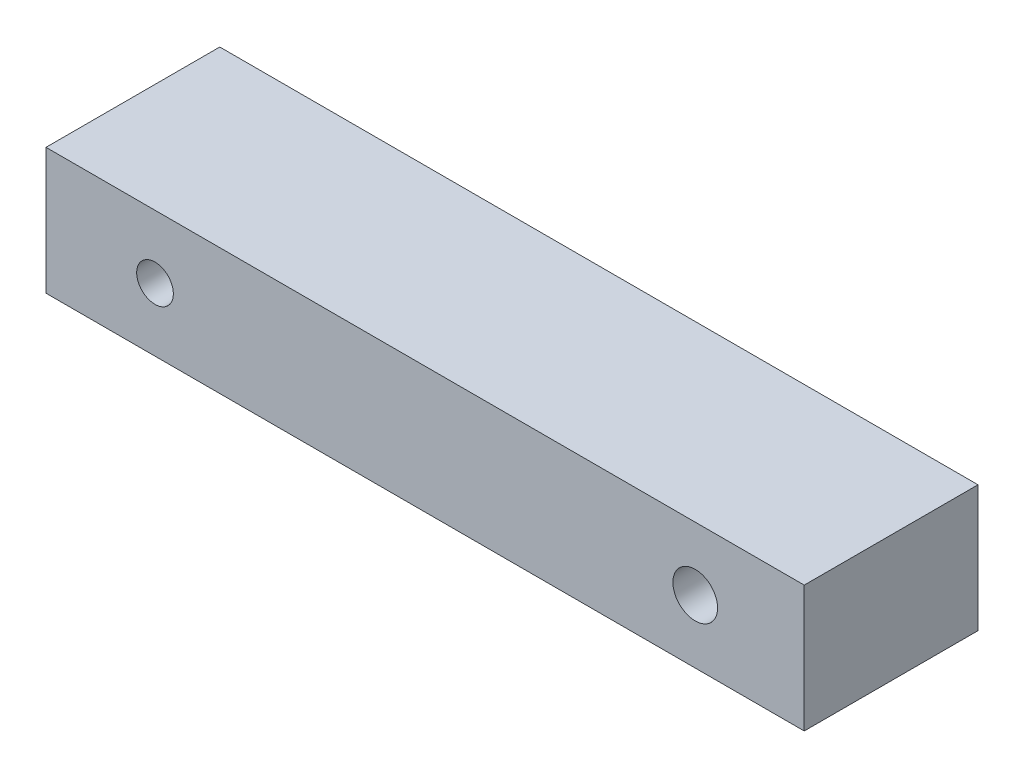
ISO-10303-21;
HEADER;
FILE_DESCRIPTION(('STEP AP214'),'2;1');
FILE_NAME('part.step','',(''),(''),'','','');
FILE_SCHEMA(('AUTOMOTIVE_DESIGN { 1 0 10303 214 1 1 1 1 }'));
ENDSEC;
DATA;
#1=APPLICATION_CONTEXT('core data for automotive mechanical design processes');
#2=APPLICATION_PROTOCOL_DEFINITION('international standard','automotive_design',2000,#1);
#3=PRODUCT_CONTEXT('',#1,'mechanical');
#4=PRODUCT('Part','Part','',(#3));
#5=PRODUCT_RELATED_PRODUCT_CATEGORY('part','',(#4));
#6=PRODUCT_DEFINITION_FORMATION('','',#4);
#7=PRODUCT_DEFINITION_CONTEXT('part definition',#1,'design');
#8=PRODUCT_DEFINITION('design','',#6,#7);
#9=PRODUCT_DEFINITION_SHAPE('','',#8);
#10=(LENGTH_UNIT() NAMED_UNIT(*) SI_UNIT(.MILLI.,.METRE.));
#11=(NAMED_UNIT(*) PLANE_ANGLE_UNIT() SI_UNIT($,.RADIAN.));
#12=(NAMED_UNIT(*) SI_UNIT($,.STERADIAN.) SOLID_ANGLE_UNIT());
#13=UNCERTAINTY_MEASURE_WITH_UNIT(LENGTH_MEASURE(1.E-05),#10,'distance_accuracy_value','');
#14=(GEOMETRIC_REPRESENTATION_CONTEXT(3) GLOBAL_UNCERTAINTY_ASSIGNED_CONTEXT((#13)) GLOBAL_UNIT_ASSIGNED_CONTEXT((#10,
#11,#12)) REPRESENTATION_CONTEXT('',''));
#15=CARTESIAN_POINT('',(0.,0.,0.));
#16=DIRECTION('',(0.,0.,1.));
#17=DIRECTION('',(1.,0.,0.));
#18=AXIS2_PLACEMENT_3D('',#15,#16,#17);
#19=CARTESIAN_POINT('',(76.2,-12.7,17.4625));
#20=DIRECTION('',(0.,1.,0.));
#21=DIRECTION('',(0.,0.,1.));
#22=AXIS2_PLACEMENT_3D('',#19,#20,#21);
#23=PLANE('',#22);
#24=DIRECTION('',(0.,0.,-1.));
#25=VECTOR('',#24,1.);
#26=CARTESIAN_POINT('',(-76.2,-12.7,17.4625));
#27=LINE('',#26,#25);
#28=CARTESIAN_POINT('',(-76.2,-12.7,17.4625));
#29=VERTEX_POINT('',#28);
#30=CARTESIAN_POINT('',(-76.2,-12.7,-17.4625));
#31=VERTEX_POINT('',#30);
#32=EDGE_CURVE('E98',#29,#31,#27,.T.);
#33=ORIENTED_EDGE('',*,*,#32,.T.);
#34=DIRECTION('',(-1.,0.,0.));
#35=VECTOR('',#34,1.);
#36=CARTESIAN_POINT('',(76.2,-12.7,-17.4625));
#37=LINE('',#36,#35);
#38=CARTESIAN_POINT('',(76.2,-12.7,-17.4625));
#39=VERTEX_POINT('',#38);
#40=EDGE_CURVE('E11',#39,#31,#37,.T.);
#41=ORIENTED_EDGE('',*,*,#40,.F.);
#42=DIRECTION('',(0.,0.,-1.));
#43=VECTOR('',#42,1.);
#44=CARTESIAN_POINT('',(76.2,-12.7,17.4625));
#45=LINE('',#44,#43);
#46=CARTESIAN_POINT('',(76.2,-12.7,17.4625));
#47=VERTEX_POINT('',#46);
#48=EDGE_CURVE('E86',#47,#39,#45,.T.);
#49=ORIENTED_EDGE('',*,*,#48,.F.);
#50=DIRECTION('',(-1.,0.,0.));
#51=VECTOR('',#50,1.);
#52=CARTESIAN_POINT('',(76.2,-12.7,17.4625));
#53=LINE('',#52,#51);
#54=EDGE_CURVE('E94',#47,#29,#53,.T.);
#55=ORIENTED_EDGE('',*,*,#54,.T.);
#56=EDGE_LOOP('',(#33,#41,#49,#55));
#57=FACE_BOUND('',#56,.T.);
#58=ADVANCED_FACE('F35',(#57),#23,.F.);
#59=CARTESIAN_POINT('',(76.2,-12.7,-17.4625));
#60=DIRECTION('',(0.,0.,1.));
#61=DIRECTION('',(1.,0.,0.));
#62=AXIS2_PLACEMENT_3D('',#59,#60,#61);
#63=PLANE('',#62);
#64=CARTESIAN_POINT('',(54.290984638385,0.,-17.4625));
#65=DIRECTION('',(0.,0.,1.));
#66=DIRECTION('',(1.,0.,0.));
#67=AXIS2_PLACEMENT_3D('',#64,#65,#66);
#68=CIRCLE('',#67,4.4911336182507);
#69=CARTESIAN_POINT('',(58.7821182566357,0.,-17.4625));
#70=VERTEX_POINT('',#69);
#71=EDGE_CURVE('E115',#70,#70,#68,.T.);
#72=ORIENTED_EDGE('',*,*,#71,.T.);
#73=EDGE_LOOP('',(#72));
#74=FACE_BOUND('',#73,.T.);
#75=CARTESIAN_POINT('',(-54.290984638385,0.,-17.4625));
#76=DIRECTION('',(0.,0.,1.));
#77=DIRECTION('',(1.,0.,0.));
#78=AXIS2_PLACEMENT_3D('',#75,#76,#77);
#79=CIRCLE('',#78,3.68750786466953);
#80=CARTESIAN_POINT('',(-50.6034767737155,0.,-17.4625));
#81=VERTEX_POINT('',#80);
#82=EDGE_CURVE('E101',#81,#81,#79,.T.);
#83=ORIENTED_EDGE('',*,*,#82,.T.);
#84=EDGE_LOOP('',(#83));
#85=FACE_BOUND('',#84,.T.);
#86=DIRECTION('',(0.,1.,0.));
#87=VECTOR('',#86,1.);
#88=CARTESIAN_POINT('',(-76.2,-12.7,-17.4625));
#89=LINE('',#88,#87);
#90=CARTESIAN_POINT('',(-76.2,12.7,-17.4625));
#91=VERTEX_POINT('',#90);
#92=EDGE_CURVE('E90',#31,#91,#89,.T.);
#93=ORIENTED_EDGE('',*,*,#92,.T.);
#94=DIRECTION('',(-1.,0.,0.));
#95=VECTOR('',#94,1.);
#96=CARTESIAN_POINT('',(76.2,12.7,-17.4625));
#97=LINE('',#96,#95);
#98=CARTESIAN_POINT('',(76.2,12.7,-17.4625));
#99=VERTEX_POINT('',#98);
#100=EDGE_CURVE('E43',#99,#91,#97,.T.);
#101=ORIENTED_EDGE('',*,*,#100,.F.);
#102=DIRECTION('',(0.,1.,0.));
#103=VECTOR('',#102,1.);
#104=CARTESIAN_POINT('',(76.2,-12.7,-17.4625));
#105=LINE('',#104,#103);
#106=EDGE_CURVE('E81',#39,#99,#105,.T.);
#107=ORIENTED_EDGE('',*,*,#106,.F.);
#108=ORIENTED_EDGE('',*,*,#40,.T.);
#109=EDGE_LOOP('',(#93,#101,#107,#108));
#110=FACE_BOUND('',#109,.T.);
#111=ADVANCED_FACE('F89',(#74,#85,#110),#63,.F.);
#112=CARTESIAN_POINT('',(76.2,12.7,17.4625));
#113=DIRECTION('',(0.,-1.,0.));
#114=DIRECTION('',(0.,0.,-1.));
#115=AXIS2_PLACEMENT_3D('',#112,#113,#114);
#116=PLANE('',#115);
#117=DIRECTION('',(0.,0.,1.));
#118=VECTOR('',#117,1.);
#119=CARTESIAN_POINT('',(-76.2,12.7,17.4625));
#120=LINE('',#119,#118);
#121=CARTESIAN_POINT('',(-76.2,12.7,17.4625));
#122=VERTEX_POINT('',#121);
#123=EDGE_CURVE('E68',#91,#122,#120,.T.);
#124=ORIENTED_EDGE('',*,*,#123,.T.);
#125=DIRECTION('',(-1.,0.,0.));
#126=VECTOR('',#125,1.);
#127=CARTESIAN_POINT('',(76.2,12.7,17.4625));
#128=LINE('',#127,#126);
#129=CARTESIAN_POINT('',(76.2,12.7,17.4625));
#130=VERTEX_POINT('',#129);
#131=EDGE_CURVE('E91',#130,#122,#128,.T.);
#132=ORIENTED_EDGE('',*,*,#131,.F.);
#133=DIRECTION('',(0.,0.,1.));
#134=VECTOR('',#133,1.);
#135=CARTESIAN_POINT('',(76.2,12.7,17.4625));
#136=LINE('',#135,#134);
#137=EDGE_CURVE('E84',#99,#130,#136,.T.);
#138=ORIENTED_EDGE('',*,*,#137,.F.);
#139=ORIENTED_EDGE('',*,*,#100,.T.);
#140=EDGE_LOOP('',(#124,#132,#138,#139));
#141=FACE_BOUND('',#140,.T.);
#142=ADVANCED_FACE('F92',(#141),#116,.F.);
#143=CARTESIAN_POINT('',(76.2,-12.7,17.4625));
#144=DIRECTION('',(0.,0.,-1.));
#145=DIRECTION('',(-1.,0.,0.));
#146=AXIS2_PLACEMENT_3D('',#143,#144,#145);
#147=PLANE('',#146);
#148=CARTESIAN_POINT('',(54.290984638385,0.,17.4625));
#149=DIRECTION('',(0.,0.,1.));
#150=DIRECTION('',(1.,0.,0.));
#151=AXIS2_PLACEMENT_3D('',#148,#149,#150);
#152=CIRCLE('',#151,4.4911336182507);
#153=CARTESIAN_POINT('',(58.7821182566357,0.,17.4625));
#154=VERTEX_POINT('',#153);
#155=EDGE_CURVE('E118',#154,#154,#152,.T.);
#156=ORIENTED_EDGE('',*,*,#155,.F.);
#157=EDGE_LOOP('',(#156));
#158=FACE_BOUND('',#157,.T.);
#159=CARTESIAN_POINT('',(-54.290984638385,0.,17.4625));
#160=DIRECTION('',(0.,0.,1.));
#161=DIRECTION('',(1.,0.,0.));
#162=AXIS2_PLACEMENT_3D('',#159,#160,#161);
#163=CIRCLE('',#162,3.68750786466953);
#164=CARTESIAN_POINT('',(-50.6034767737155,0.,17.4625));
#165=VERTEX_POINT('',#164);
#166=EDGE_CURVE('E112',#165,#165,#163,.T.);
#167=ORIENTED_EDGE('',*,*,#166,.F.);
#168=EDGE_LOOP('',(#167));
#169=FACE_BOUND('',#168,.T.);
#170=DIRECTION('',(0.,-1.,0.));
#171=VECTOR('',#170,1.);
#172=CARTESIAN_POINT('',(-76.2,-12.7,17.4625));
#173=LINE('',#172,#171);
#174=EDGE_CURVE('E74',#122,#29,#173,.T.);
#175=ORIENTED_EDGE('',*,*,#174,.T.);
#176=ORIENTED_EDGE('',*,*,#54,.F.);
#177=DIRECTION('',(0.,-1.,0.));
#178=VECTOR('',#177,1.);
#179=CARTESIAN_POINT('',(76.2,-12.7,17.4625));
#180=LINE('',#179,#178);
#181=EDGE_CURVE('E51',#130,#47,#180,.T.);
#182=ORIENTED_EDGE('',*,*,#181,.F.);
#183=ORIENTED_EDGE('',*,*,#131,.T.);
#184=EDGE_LOOP('',(#175,#176,#182,#183));
#185=FACE_BOUND('',#184,.T.);
#186=ADVANCED_FACE('F106',(#158,#169,#185),#147,.F.);
#187=CARTESIAN_POINT('',(76.2,-12.7,-17.4625));
#188=DIRECTION('',(1.,0.,0.));
#189=DIRECTION('',(0.,0.,-1.));
#190=AXIS2_PLACEMENT_3D('',#187,#188,#189);
#191=PLANE('',#190);
#192=ORIENTED_EDGE('',*,*,#48,.T.);
#193=ORIENTED_EDGE('',*,*,#106,.T.);
#194=ORIENTED_EDGE('',*,*,#137,.T.);
#195=ORIENTED_EDGE('',*,*,#181,.T.);
#196=EDGE_LOOP('',(#192,#193,#194,#195));
#197=FACE_BOUND('',#196,.T.);
#198=ADVANCED_FACE('F82',(#197),#191,.T.);
#199=CARTESIAN_POINT('',(-76.2,-12.7,-17.4625));
#200=DIRECTION('',(1.,0.,0.));
#201=DIRECTION('',(0.,0.,-1.));
#202=AXIS2_PLACEMENT_3D('',#199,#200,#201);
#203=PLANE('',#202);
#204=ORIENTED_EDGE('',*,*,#32,.F.);
#205=ORIENTED_EDGE('',*,*,#174,.F.);
#206=ORIENTED_EDGE('',*,*,#123,.F.);
#207=ORIENTED_EDGE('',*,*,#92,.F.);
#208=EDGE_LOOP('',(#204,#205,#206,#207));
#209=FACE_BOUND('',#208,.T.);
#210=ADVANCED_FACE('F109',(#209),#203,.F.);
#211=CARTESIAN_POINT('',(-54.290984638385,0.,-17.4625));
#212=DIRECTION('',(0.,0.,1.));
#213=DIRECTION('',(1.,0.,0.));
#214=AXIS2_PLACEMENT_3D('',#211,#212,#213);
#215=CYLINDRICAL_SURFACE('',#214,3.68750786466953);
#216=ORIENTED_EDGE('',*,*,#82,.F.);
#217=EDGE_LOOP('',(#216));
#218=FACE_BOUND('',#217,.T.);
#219=ORIENTED_EDGE('',*,*,#166,.T.);
#220=EDGE_LOOP('',(#219));
#221=FACE_BOUND('',#220,.T.);
#222=ADVANCED_FACE('F129',(#218,#221),#215,.F.);
#223=CARTESIAN_POINT('',(54.290984638385,0.,-17.4625));
#224=DIRECTION('',(0.,0.,1.));
#225=DIRECTION('',(1.,0.,0.));
#226=AXIS2_PLACEMENT_3D('',#223,#224,#225);
#227=CYLINDRICAL_SURFACE('',#226,4.4911336182507);
#228=ORIENTED_EDGE('',*,*,#71,.F.);
#229=EDGE_LOOP('',(#228));
#230=FACE_BOUND('',#229,.T.);
#231=ORIENTED_EDGE('',*,*,#155,.T.);
#232=EDGE_LOOP('',(#231));
#233=FACE_BOUND('',#232,.T.);
#234=ADVANCED_FACE('F126',(#230,#233),#227,.F.);
#235=CLOSED_SHELL('',(#58,#111,#142,#186,#198,#210,#222,#234));
#236=MANIFOLD_SOLID_BREP('B2',#235);
#237=ADVANCED_BREP_SHAPE_REPRESENTATION('',(#18,#236),#14);
#238=SHAPE_DEFINITION_REPRESENTATION(#9,#237);
ENDSEC;
END-ISO-10303-21;
